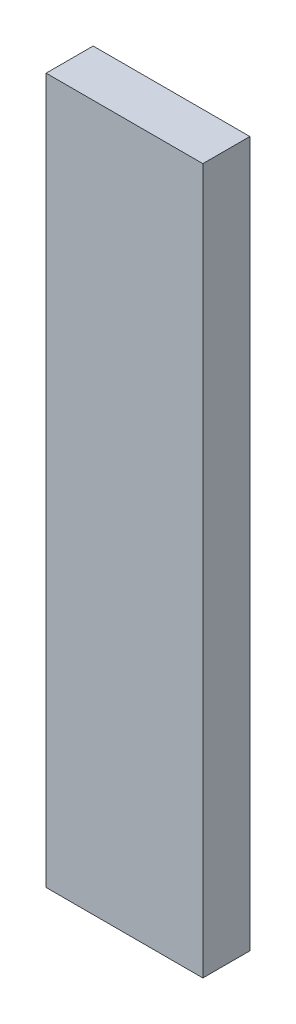
ISO-10303-21;
HEADER;
FILE_DESCRIPTION(('STEP AP214'),'2;1');
FILE_NAME('part.step','',(''),(''),'','','');
FILE_SCHEMA(('AUTOMOTIVE_DESIGN { 1 0 10303 214 1 1 1 1 }'));
ENDSEC;
DATA;
#1=APPLICATION_CONTEXT('core data for automotive mechanical design processes');
#2=APPLICATION_PROTOCOL_DEFINITION('international standard','automotive_design',2000,#1);
#3=PRODUCT_CONTEXT('',#1,'mechanical');
#4=PRODUCT('Part','Part','',(#3));
#5=PRODUCT_RELATED_PRODUCT_CATEGORY('part','',(#4));
#6=PRODUCT_DEFINITION_FORMATION('','',#4);
#7=PRODUCT_DEFINITION_CONTEXT('part definition',#1,'design');
#8=PRODUCT_DEFINITION('design','',#6,#7);
#9=PRODUCT_DEFINITION_SHAPE('','',#8);
#10=(LENGTH_UNIT() NAMED_UNIT(*) SI_UNIT(.MILLI.,.METRE.));
#11=(NAMED_UNIT(*) PLANE_ANGLE_UNIT() SI_UNIT($,.RADIAN.));
#12=(NAMED_UNIT(*) SI_UNIT($,.STERADIAN.) SOLID_ANGLE_UNIT());
#13=UNCERTAINTY_MEASURE_WITH_UNIT(LENGTH_MEASURE(1.E-05),#10,'distance_accuracy_value','');
#14=(GEOMETRIC_REPRESENTATION_CONTEXT(3) GLOBAL_UNCERTAINTY_ASSIGNED_CONTEXT((#13)) GLOBAL_UNIT_ASSIGNED_CONTEXT((#10,
#11,#12)) REPRESENTATION_CONTEXT('',''));
#15=CARTESIAN_POINT('',(0.,0.,0.));
#16=DIRECTION('',(0.,0.,1.));
#17=DIRECTION('',(1.,0.,0.));
#18=AXIS2_PLACEMENT_3D('',#15,#16,#17);
#19=CARTESIAN_POINT('',(0.,0.,30.));
#20=DIRECTION('',(1.,0.,0.));
#21=DIRECTION('',(0.,0.,-1.));
#22=AXIS2_PLACEMENT_3D('',#19,#20,#21);
#23=PLANE('',#22);
#24=DIRECTION('',(0.,-1.,0.));
#25=VECTOR('',#24,1.);
#26=CARTESIAN_POINT('',(0.,0.,0.));
#27=LINE('',#26,#25);
#28=CARTESIAN_POINT('',(0.,450.,0.));
#29=VERTEX_POINT('',#28);
#30=CARTESIAN_POINT('',(0.,0.,0.));
#31=VERTEX_POINT('',#30);
#32=EDGE_CURVE('E100',#29,#31,#27,.T.);
#33=ORIENTED_EDGE('',*,*,#32,.T.);
#34=DIRECTION('',(0.,0.,-1.));
#35=VECTOR('',#34,1.);
#36=CARTESIAN_POINT('',(0.,0.,30.));
#37=LINE('',#36,#35);
#38=CARTESIAN_POINT('',(0.,0.,30.));
#39=VERTEX_POINT('',#38);
#40=EDGE_CURVE('E11',#39,#31,#37,.T.);
#41=ORIENTED_EDGE('',*,*,#40,.F.);
#42=DIRECTION('',(0.,-1.,0.));
#43=VECTOR('',#42,1.);
#44=CARTESIAN_POINT('',(0.,0.,30.));
#45=LINE('',#44,#43);
#46=CARTESIAN_POINT('',(0.,450.,30.));
#47=VERTEX_POINT('',#46);
#48=EDGE_CURVE('E88',#47,#39,#45,.T.);
#49=ORIENTED_EDGE('',*,*,#48,.F.);
#50=DIRECTION('',(0.,0.,-1.));
#51=VECTOR('',#50,1.);
#52=CARTESIAN_POINT('',(0.,450.,30.));
#53=LINE('',#52,#51);
#54=EDGE_CURVE('E96',#47,#29,#53,.T.);
#55=ORIENTED_EDGE('',*,*,#54,.T.);
#56=EDGE_LOOP('',(#33,#41,#49,#55));
#57=FACE_BOUND('',#56,.T.);
#58=ADVANCED_FACE('F37',(#57),#23,.F.);
#59=CARTESIAN_POINT('',(0.,0.,30.));
#60=DIRECTION('',(0.,1.,0.));
#61=DIRECTION('',(0.,0.,1.));
#62=AXIS2_PLACEMENT_3D('',#59,#60,#61);
#63=PLANE('',#62);
#64=DIRECTION('',(1.,0.,0.));
#65=VECTOR('',#64,1.);
#66=CARTESIAN_POINT('',(0.,0.,0.));
#67=LINE('',#66,#65);
#68=CARTESIAN_POINT('',(100.,0.,0.));
#69=VERTEX_POINT('',#68);
#70=EDGE_CURVE('E92',#31,#69,#67,.T.);
#71=ORIENTED_EDGE('',*,*,#70,.T.);
#72=DIRECTION('',(0.,0.,-1.));
#73=VECTOR('',#72,1.);
#74=CARTESIAN_POINT('',(100.,0.,30.));
#75=LINE('',#74,#73);
#76=CARTESIAN_POINT('',(100.,0.,30.));
#77=VERTEX_POINT('',#76);
#78=EDGE_CURVE('E45',#77,#69,#75,.T.);
#79=ORIENTED_EDGE('',*,*,#78,.F.);
#80=DIRECTION('',(1.,0.,0.));
#81=VECTOR('',#80,1.);
#82=CARTESIAN_POINT('',(0.,0.,30.));
#83=LINE('',#82,#81);
#84=EDGE_CURVE('E83',#39,#77,#83,.T.);
#85=ORIENTED_EDGE('',*,*,#84,.F.);
#86=ORIENTED_EDGE('',*,*,#40,.T.);
#87=EDGE_LOOP('',(#71,#79,#85,#86));
#88=FACE_BOUND('',#87,.T.);
#89=ADVANCED_FACE('F91',(#88),#63,.F.);
#90=CARTESIAN_POINT('',(100.,0.,30.));
#91=DIRECTION('',(-1.,0.,0.));
#92=DIRECTION('',(0.,-1.,0.));
#93=AXIS2_PLACEMENT_3D('',#90,#91,#92);
#94=PLANE('',#93);
#95=DIRECTION('',(0.,1.,0.));
#96=VECTOR('',#95,1.);
#97=CARTESIAN_POINT('',(100.,0.,0.));
#98=LINE('',#97,#96);
#99=CARTESIAN_POINT('',(99.9999999999999,450.,0.));
#100=VERTEX_POINT('',#99);
#101=EDGE_CURVE('E70',#69,#100,#98,.T.);
#102=ORIENTED_EDGE('',*,*,#101,.T.);
#103=DIRECTION('',(0.,0.,-1.));
#104=VECTOR('',#103,1.);
#105=CARTESIAN_POINT('',(99.9999999999999,450.,30.));
#106=LINE('',#105,#104);
#107=CARTESIAN_POINT('',(99.9999999999999,450.,30.));
#108=VERTEX_POINT('',#107);
#109=EDGE_CURVE('E93',#108,#100,#106,.T.);
#110=ORIENTED_EDGE('',*,*,#109,.F.);
#111=DIRECTION('',(0.,1.,0.));
#112=VECTOR('',#111,1.);
#113=CARTESIAN_POINT('',(100.,0.,30.));
#114=LINE('',#113,#112);
#115=EDGE_CURVE('E86',#77,#108,#114,.T.);
#116=ORIENTED_EDGE('',*,*,#115,.F.);
#117=ORIENTED_EDGE('',*,*,#78,.T.);
#118=EDGE_LOOP('',(#102,#110,#116,#117));
#119=FACE_BOUND('',#118,.T.);
#120=ADVANCED_FACE('F94',(#119),#94,.F.);
#121=CARTESIAN_POINT('',(0.,450.,30.));
#122=DIRECTION('',(0.,-1.,0.));
#123=DIRECTION('',(0.,0.,-1.));
#124=AXIS2_PLACEMENT_3D('',#121,#122,#123);
#125=PLANE('',#124);
#126=DIRECTION('',(-1.,0.,0.));
#127=VECTOR('',#126,1.);
#128=CARTESIAN_POINT('',(0.,450.,0.));
#129=LINE('',#128,#127);
#130=EDGE_CURVE('E76',#100,#29,#129,.T.);
#131=ORIENTED_EDGE('',*,*,#130,.T.);
#132=ORIENTED_EDGE('',*,*,#54,.F.);
#133=DIRECTION('',(-1.,0.,0.));
#134=VECTOR('',#133,1.);
#135=CARTESIAN_POINT('',(0.,450.,30.));
#136=LINE('',#135,#134);
#137=EDGE_CURVE('E53',#108,#47,#136,.T.);
#138=ORIENTED_EDGE('',*,*,#137,.F.);
#139=ORIENTED_EDGE('',*,*,#109,.T.);
#140=EDGE_LOOP('',(#131,#132,#138,#139));
#141=FACE_BOUND('',#140,.T.);
#142=ADVANCED_FACE('F107',(#141),#125,.F.);
#143=CARTESIAN_POINT('',(0.,0.,30.));
#144=DIRECTION('',(0.,0.,-1.));
#145=DIRECTION('',(-1.,0.,0.));
#146=AXIS2_PLACEMENT_3D('',#143,#144,#145);
#147=PLANE('',#146);
#148=ORIENTED_EDGE('',*,*,#48,.T.);
#149=ORIENTED_EDGE('',*,*,#84,.T.);
#150=ORIENTED_EDGE('',*,*,#115,.T.);
#151=ORIENTED_EDGE('',*,*,#137,.T.);
#152=EDGE_LOOP('',(#148,#149,#150,#151));
#153=FACE_BOUND('',#152,.T.);
#154=ADVANCED_FACE('F84',(#153),#147,.F.);
#155=CARTESIAN_POINT('',(0.,0.,0.));
#156=DIRECTION('',(0.,0.,-1.));
#157=DIRECTION('',(-1.,0.,0.));
#158=AXIS2_PLACEMENT_3D('',#155,#156,#157);
#159=PLANE('',#158);
#160=ORIENTED_EDGE('',*,*,#32,.F.);
#161=ORIENTED_EDGE('',*,*,#130,.F.);
#162=ORIENTED_EDGE('',*,*,#101,.F.);
#163=ORIENTED_EDGE('',*,*,#70,.F.);
#164=EDGE_LOOP('',(#160,#161,#162,#163));
#165=FACE_BOUND('',#164,.T.);
#166=ADVANCED_FACE('F110',(#165),#159,.T.);
#167=CLOSED_SHELL('',(#58,#89,#120,#142,#154,#166));
#168=MANIFOLD_SOLID_BREP('B2',#167);
#169=ADVANCED_BREP_SHAPE_REPRESENTATION('',(#18,#168),#14);
#170=SHAPE_DEFINITION_REPRESENTATION(#9,#169);
ENDSEC;
END-ISO-10303-21;
